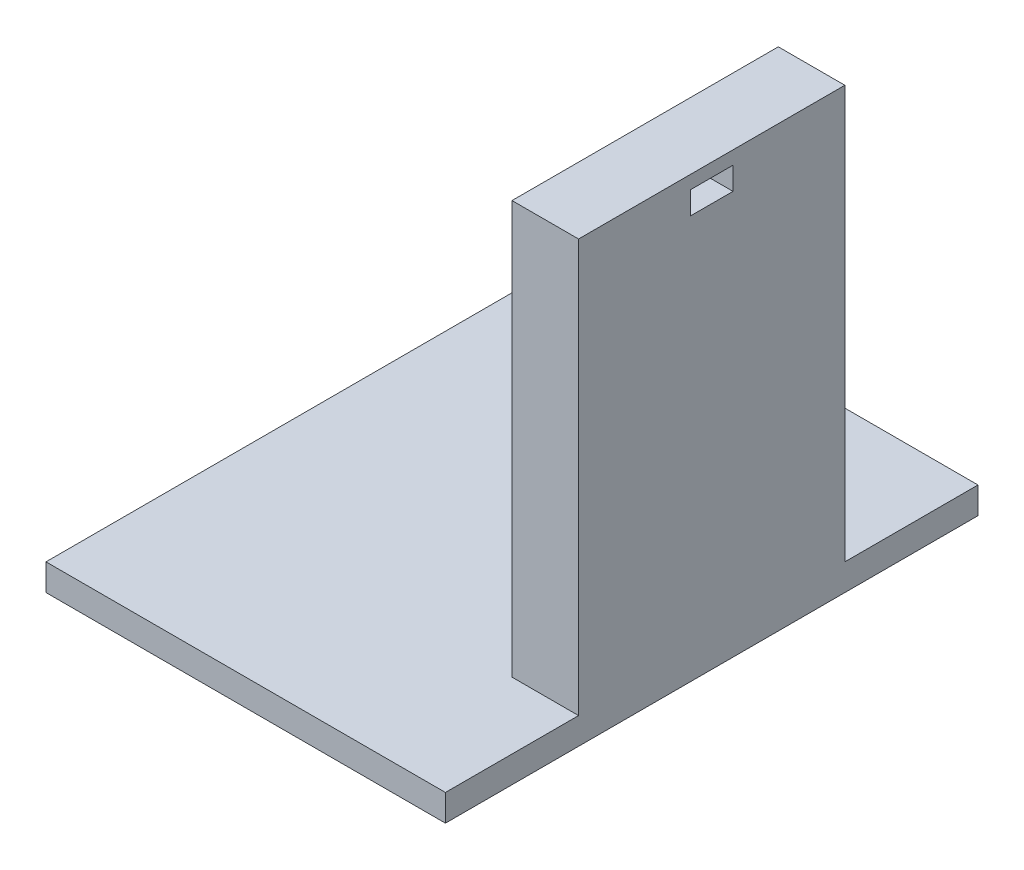
ISO-10303-21;
HEADER;
FILE_DESCRIPTION(('STEP AP214'),'2;1');
FILE_NAME('part.step','',(''),(''),'','','');
FILE_SCHEMA(('AUTOMOTIVE_DESIGN { 1 0 10303 214 1 1 1 1 }'));
ENDSEC;
DATA;
#1=APPLICATION_CONTEXT('core data for automotive mechanical design processes');
#2=APPLICATION_PROTOCOL_DEFINITION('international standard','automotive_design',2000,#1);
#3=PRODUCT_CONTEXT('',#1,'mechanical');
#4=PRODUCT('Part','Part','',(#3));
#5=PRODUCT_RELATED_PRODUCT_CATEGORY('part','',(#4));
#6=PRODUCT_DEFINITION_FORMATION('','',#4);
#7=PRODUCT_DEFINITION_CONTEXT('part definition',#1,'design');
#8=PRODUCT_DEFINITION('design','',#6,#7);
#9=PRODUCT_DEFINITION_SHAPE('','',#8);
#10=(LENGTH_UNIT() NAMED_UNIT(*) SI_UNIT(.MILLI.,.METRE.));
#11=(NAMED_UNIT(*) PLANE_ANGLE_UNIT() SI_UNIT($,.RADIAN.));
#12=(NAMED_UNIT(*) SI_UNIT($,.STERADIAN.) SOLID_ANGLE_UNIT());
#13=UNCERTAINTY_MEASURE_WITH_UNIT(LENGTH_MEASURE(1.E-05),#10,'distance_accuracy_value','');
#14=(GEOMETRIC_REPRESENTATION_CONTEXT(3) GLOBAL_UNCERTAINTY_ASSIGNED_CONTEXT((#13)) GLOBAL_UNIT_ASSIGNED_CONTEXT((#10,
#11,#12)) REPRESENTATION_CONTEXT('',''));
#15=CARTESIAN_POINT('',(0.,0.,0.));
#16=DIRECTION('',(0.,0.,1.));
#17=DIRECTION('',(1.,0.,0.));
#18=AXIS2_PLACEMENT_3D('',#15,#16,#17);
#19=CARTESIAN_POINT('',(-108.108131118763,5.,-106.7));
#20=DIRECTION('',(0.,-1.,0.));
#21=DIRECTION('',(0.,0.,-1.));
#22=AXIS2_PLACEMENT_3D('',#19,#20,#21);
#23=PLANE('',#22);
#24=CARTESIAN_POINT('',(-85.1540655593813,5.,-81.7));
#25=DIRECTION('',(0.,-1.,0.));
#26=DIRECTION('',(0.,0.,-1.));
#27=AXIS2_PLACEMENT_3D('',#24,#25,#26);
#28=CIRCLE('',#27,4.99999999999999);
#29=CARTESIAN_POINT('',(-85.1540655593813,5.,-86.7));
#30=VERTEX_POINT('',#29);
#31=EDGE_CURVE('E38',#30,#30,#28,.F.);
#32=ORIENTED_EDGE('',*,*,#31,.T.);
#33=EDGE_LOOP('',(#32));
#34=FACE_BOUND('',#33,.T.);
#35=DIRECTION('',(1.,0.,0.));
#36=VECTOR('',#35,1.);
#37=CARTESIAN_POINT('',(-108.108131118763,5.,-106.7));
#38=LINE('',#37,#36);
#39=CARTESIAN_POINT('',(-95.3081311187625,5.,-106.7));
#40=VERTEX_POINT('',#39);
#41=CARTESIAN_POINT('',(-75.,5.,-106.7));
#42=VERTEX_POINT('',#41);
#43=EDGE_CURVE('E196',#40,#42,#38,.T.);
#44=ORIENTED_EDGE('',*,*,#43,.T.);
#45=DIRECTION('',(0.,0.,1.));
#46=VECTOR('',#45,1.);
#47=CARTESIAN_POINT('',(-75.,5.,-56.7));
#48=LINE('',#47,#46);
#49=CARTESIAN_POINT('',(-75.,5.,-56.7));
#50=VERTEX_POINT('',#49);
#51=EDGE_CURVE('E195',#42,#50,#48,.T.);
#52=ORIENTED_EDGE('',*,*,#51,.T.);
#53=DIRECTION('',(1.,0.,0.));
#54=VECTOR('',#53,1.);
#55=CARTESIAN_POINT('',(-108.108131118763,5.,-56.7));
#56=LINE('',#55,#54);
#57=CARTESIAN_POINT('',(-95.3081311187625,5.,-56.7));
#58=VERTEX_POINT('',#57);
#59=EDGE_CURVE('E184',#58,#50,#56,.T.);
#60=ORIENTED_EDGE('',*,*,#59,.F.);
#61=DIRECTION('',(0.,0.,-1.));
#62=VECTOR('',#61,1.);
#63=CARTESIAN_POINT('',(-95.3081311187625,5.,-181.7));
#64=LINE('',#63,#62);
#65=EDGE_CURVE('E11',#58,#40,#64,.T.);
#66=ORIENTED_EDGE('',*,*,#65,.T.);
#67=EDGE_LOOP('',(#44,#52,#60,#66));
#68=FACE_BOUND('',#67,.T.);
#69=ADVANCED_FACE('F34',(#34,#68),#23,.T.);
#70=CARTESIAN_POINT('',(-108.108131118763,5.,-106.7));
#71=DIRECTION('',(0.,0.,1.));
#72=DIRECTION('',(1.,0.,0.));
#73=AXIS2_PLACEMENT_3D('',#70,#71,#72);
#74=PLANE('',#73);
#75=DIRECTION('',(1.,0.,0.));
#76=VECTOR('',#75,1.);
#77=CARTESIAN_POINT('',(0.,0.,-106.7));
#78=LINE('',#77,#76);
#79=CARTESIAN_POINT('',(-95.3081311187625,0.,-106.7));
#80=VERTEX_POINT('',#79);
#81=CARTESIAN_POINT('',(-75.,0.,-106.7));
#82=VERTEX_POINT('',#81);
#83=EDGE_CURVE('E43',#80,#82,#78,.T.);
#84=ORIENTED_EDGE('',*,*,#83,.T.);
#85=DIRECTION('',(0.,1.,0.));
#86=VECTOR('',#85,1.);
#87=CARTESIAN_POINT('',(-75.,5.00000000000002,-106.7));
#88=LINE('',#87,#86);
#89=EDGE_CURVE('E50',#82,#42,#88,.T.);
#90=ORIENTED_EDGE('',*,*,#89,.T.);
#91=ORIENTED_EDGE('',*,*,#43,.F.);
#92=DIRECTION('',(0.,-1.,0.));
#93=VECTOR('',#92,1.);
#94=CARTESIAN_POINT('',(-95.3081311187625,10.,-106.7));
#95=LINE('',#94,#93);
#96=EDGE_CURVE('E191',#40,#80,#95,.T.);
#97=ORIENTED_EDGE('',*,*,#96,.T.);
#98=EDGE_LOOP('',(#84,#90,#91,#97));
#99=FACE_BOUND('',#98,.T.);
#100=ADVANCED_FACE('F379',(#99),#74,.T.);
#101=CARTESIAN_POINT('',(-108.108131118763,5.,-56.7));
#102=DIRECTION('',(0.,0.,-1.));
#103=DIRECTION('',(0.,1.,0.));
#104=AXIS2_PLACEMENT_3D('',#101,#102,#103);
#105=PLANE('',#104);
#106=ORIENTED_EDGE('',*,*,#59,.T.);
#107=DIRECTION('',(0.,-1.,0.));
#108=VECTOR('',#107,1.);
#109=CARTESIAN_POINT('',(-75.,5.,-56.7));
#110=LINE('',#109,#108);
#111=CARTESIAN_POINT('',(-75.,0.,-56.7));
#112=VERTEX_POINT('',#111);
#113=EDGE_CURVE('E492',#50,#112,#110,.T.);
#114=ORIENTED_EDGE('',*,*,#113,.T.);
#115=DIRECTION('',(-1.,0.,0.));
#116=VECTOR('',#115,1.);
#117=CARTESIAN_POINT('',(0.,0.,-56.7));
#118=LINE('',#117,#116);
#119=CARTESIAN_POINT('',(-95.3081311187625,0.,-56.7));
#120=VERTEX_POINT('',#119);
#121=EDGE_CURVE('E187',#112,#120,#118,.T.);
#122=ORIENTED_EDGE('',*,*,#121,.T.);
#123=DIRECTION('',(0.,1.,0.));
#124=VECTOR('',#123,1.);
#125=CARTESIAN_POINT('',(-95.3081311187625,10.0000000000002,-56.7));
#126=LINE('',#125,#124);
#127=EDGE_CURVE('E181',#120,#58,#126,.T.);
#128=ORIENTED_EDGE('',*,*,#127,.T.);
#129=EDGE_LOOP('',(#106,#114,#122,#128));
#130=FACE_BOUND('',#129,.T.);
#131=ADVANCED_FACE('F183',(#130),#105,.T.);
#132=CARTESIAN_POINT('',(-95.3081311187625,10.,-181.7));
#133=DIRECTION('',(1.,0.,0.));
#134=DIRECTION('',(0.,0.,-1.));
#135=AXIS2_PLACEMENT_3D('',#132,#133,#134);
#136=PLANE('',#135);
#137=ORIENTED_EDGE('',*,*,#96,.F.);
#138=ORIENTED_EDGE('',*,*,#65,.F.);
#139=ORIENTED_EDGE('',*,*,#127,.F.);
#140=DIRECTION('',(0.,0.,1.));
#141=VECTOR('',#140,1.);
#142=CARTESIAN_POINT('',(-95.3081311187625,0.,-181.7));
#143=LINE('',#142,#141);
#144=CARTESIAN_POINT('',(-95.3081311187625,0.,18.3));
#145=VERTEX_POINT('',#144);
#146=EDGE_CURVE('E315',#120,#145,#143,.T.);
#147=ORIENTED_EDGE('',*,*,#146,.T.);
#148=DIRECTION('',(0.,-1.,0.));
#149=VECTOR('',#148,1.);
#150=CARTESIAN_POINT('',(-95.3081311187625,10.,18.3));
#151=LINE('',#150,#149);
#152=CARTESIAN_POINT('',(-95.3081311187625,10.,18.3));
#153=VERTEX_POINT('',#152);
#154=EDGE_CURVE('E341',#153,#145,#151,.T.);
#155=ORIENTED_EDGE('',*,*,#154,.F.);
#156=DIRECTION('',(0.,0.,1.));
#157=VECTOR('',#156,1.);
#158=CARTESIAN_POINT('',(-95.3081311187625,10.,-181.7));
#159=LINE('',#158,#157);
#160=CARTESIAN_POINT('',(-95.3081311187625,10.,-181.7));
#161=VERTEX_POINT('',#160);
#162=EDGE_CURVE('E316',#161,#153,#159,.T.);
#163=ORIENTED_EDGE('',*,*,#162,.F.);
#164=DIRECTION('',(0.,-1.,0.));
#165=VECTOR('',#164,1.);
#166=CARTESIAN_POINT('',(-95.3081311187625,10.,-181.7));
#167=LINE('',#166,#165);
#168=CARTESIAN_POINT('',(-95.3081311187625,0.,-181.7));
#169=VERTEX_POINT('',#168);
#170=EDGE_CURVE('E327',#161,#169,#167,.T.);
#171=ORIENTED_EDGE('',*,*,#170,.T.);
#172=EDGE_CURVE('E202',#169,#80,#143,.T.);
#173=ORIENTED_EDGE('',*,*,#172,.T.);
#174=EDGE_LOOP('',(#137,#138,#139,#147,#155,#163,#171,#173));
#175=FACE_BOUND('',#174,.T.);
#176=ADVANCED_FACE('F36',(#175),#136,.F.);
#177=CARTESIAN_POINT('',(0.,0.,0.));
#178=DIRECTION('',(0.,1.,0.));
#179=DIRECTION('',(0.,0.,1.));
#180=AXIS2_PLACEMENT_3D('',#177,#178,#179);
#181=PLANE('',#180);
#182=ORIENTED_EDGE('',*,*,#121,.F.);
#183=DIRECTION('',(0.,0.,-1.));
#184=VECTOR('',#183,1.);
#185=CARTESIAN_POINT('',(-75.,0.,-56.7000000000001));
#186=LINE('',#185,#184);
#187=EDGE_CURVE('E490',#112,#82,#186,.T.);
#188=ORIENTED_EDGE('',*,*,#187,.T.);
#189=ORIENTED_EDGE('',*,*,#83,.F.);
#190=ORIENTED_EDGE('',*,*,#172,.F.);
#191=DIRECTION('',(-1.,0.,0.));
#192=VECTOR('',#191,1.);
#193=CARTESIAN_POINT('',(-95.3081311187625,0.,-181.7));
#194=LINE('',#193,#192);
#195=CARTESIAN_POINT('',(54.6918688812375,0.,-181.7));
#196=VERTEX_POINT('',#195);
#197=EDGE_CURVE('E320',#196,#169,#194,.T.);
#198=ORIENTED_EDGE('',*,*,#197,.F.);
#199=DIRECTION('',(0.,0.,-1.));
#200=VECTOR('',#199,1.);
#201=CARTESIAN_POINT('',(54.6918688812375,0.,-181.7));
#202=LINE('',#201,#200);
#203=CARTESIAN_POINT('',(54.6918688812375,0.,18.3));
#204=VERTEX_POINT('',#203);
#205=EDGE_CURVE('E331',#204,#196,#202,.T.);
#206=ORIENTED_EDGE('',*,*,#205,.F.);
#207=DIRECTION('',(1.,0.,0.));
#208=VECTOR('',#207,1.);
#209=CARTESIAN_POINT('',(-95.3081311187625,0.,18.3));
#210=LINE('',#209,#208);
#211=EDGE_CURVE('E329',#145,#204,#210,.T.);
#212=ORIENTED_EDGE('',*,*,#211,.F.);
#213=ORIENTED_EDGE('',*,*,#146,.F.);
#214=EDGE_LOOP('',(#182,#188,#189,#190,#198,#206,#212,#213));
#215=FACE_BOUND('',#214,.T.);
#216=ADVANCED_FACE('F407',(#215),#181,.F.);
#217=CARTESIAN_POINT('',(0.,160.,0.));
#218=DIRECTION('',(0.,1.,0.));
#219=DIRECTION('',(0.,0.,1.));
#220=AXIS2_PLACEMENT_3D('',#217,#218,#219);
#221=PLANE('',#220);
#222=DIRECTION('',(0.,0.,1.));
#223=VECTOR('',#222,1.);
#224=CARTESIAN_POINT('',(41.8918688812375,160.,0.));
#225=LINE('',#224,#223);
#226=CARTESIAN_POINT('',(41.8918688812375,160.,-89.7));
#227=VERTEX_POINT('',#226);
#228=CARTESIAN_POINT('',(41.8918688812375,160.,-73.7));
#229=VERTEX_POINT('',#228);
#230=EDGE_CURVE('E344',#227,#229,#225,.T.);
#231=ORIENTED_EDGE('',*,*,#230,.F.);
#232=DIRECTION('',(-1.,0.,0.));
#233=VECTOR('',#232,1.);
#234=CARTESIAN_POINT('',(84.0918688812375,160.,-89.7));
#235=LINE('',#234,#233);
#236=CARTESIAN_POINT('',(54.6918688812375,160.,-89.7));
#237=VERTEX_POINT('',#236);
#238=EDGE_CURVE('E265',#237,#227,#235,.T.);
#239=ORIENTED_EDGE('',*,*,#238,.F.);
#240=DIRECTION('',(0.,0.,-1.));
#241=VECTOR('',#240,1.);
#242=CARTESIAN_POINT('',(54.6918688812375,160.,-131.7));
#243=LINE('',#242,#241);
#244=CARTESIAN_POINT('',(54.6918688812375,160.,-73.7));
#245=VERTEX_POINT('',#244);
#246=EDGE_CURVE('E215',#245,#237,#243,.T.);
#247=ORIENTED_EDGE('',*,*,#246,.F.);
#248=DIRECTION('',(-1.,0.,0.));
#249=VECTOR('',#248,1.);
#250=CARTESIAN_POINT('',(84.0918688812375,160.,-73.7));
#251=LINE('',#250,#249);
#252=EDGE_CURVE('E269',#245,#229,#251,.T.);
#253=ORIENTED_EDGE('',*,*,#252,.T.);
#254=EDGE_LOOP('',(#231,#239,#247,#253));
#255=FACE_BOUND('',#254,.T.);
#256=ADVANCED_FACE('F357',(#255),#221,.F.);
#257=CARTESIAN_POINT('',(0.,10.,0.));
#258=DIRECTION('',(0.,1.,0.));
#259=DIRECTION('',(0.,0.,1.));
#260=AXIS2_PLACEMENT_3D('',#257,#258,#259);
#261=PLANE('',#260);
#262=DIRECTION('',(0.,0.,-1.));
#263=VECTOR('',#262,1.);
#264=CARTESIAN_POINT('',(54.6918688812375,10.,-181.7));
#265=LINE('',#264,#263);
#266=CARTESIAN_POINT('',(54.6918688812375,10.,18.3));
#267=VERTEX_POINT('',#266);
#268=CARTESIAN_POINT('',(54.6918688812375,10.,-31.7));
#269=VERTEX_POINT('',#268);
#270=EDGE_CURVE('E323',#267,#269,#265,.T.);
#271=ORIENTED_EDGE('',*,*,#270,.T.);
#272=DIRECTION('',(-1.,0.,0.));
#273=VECTOR('',#272,1.);
#274=CARTESIAN_POINT('',(0.,10.,-31.7));
#275=LINE('',#274,#273);
#276=CARTESIAN_POINT('',(29.6918688812375,10.,-31.7));
#277=VERTEX_POINT('',#276);
#278=EDGE_CURVE('E313',#269,#277,#275,.T.);
#279=ORIENTED_EDGE('',*,*,#278,.T.);
#280=DIRECTION('',(0.,0.,1.));
#281=VECTOR('',#280,1.);
#282=CARTESIAN_POINT('',(29.6918688812375,10.,0.));
#283=LINE('',#282,#281);
#284=CARTESIAN_POINT('',(29.6918688812375,10.,-131.7));
#285=VERTEX_POINT('',#284);
#286=EDGE_CURVE('E307',#285,#277,#283,.T.);
#287=ORIENTED_EDGE('',*,*,#286,.F.);
#288=DIRECTION('',(-1.,0.,0.));
#289=VECTOR('',#288,1.);
#290=CARTESIAN_POINT('',(0.,10.,-131.7));
#291=LINE('',#290,#289);
#292=CARTESIAN_POINT('',(54.6918688812375,10.,-131.7));
#293=VERTEX_POINT('',#292);
#294=EDGE_CURVE('E310',#293,#285,#291,.T.);
#295=ORIENTED_EDGE('',*,*,#294,.F.);
#296=CARTESIAN_POINT('',(54.6918688812375,10.,-181.7));
#297=VERTEX_POINT('',#296);
#298=EDGE_CURVE('E322',#293,#297,#265,.T.);
#299=ORIENTED_EDGE('',*,*,#298,.T.);
#300=DIRECTION('',(-1.,0.,0.));
#301=VECTOR('',#300,1.);
#302=CARTESIAN_POINT('',(-95.3081311187625,10.,-181.7));
#303=LINE('',#302,#301);
#304=EDGE_CURVE('E325',#297,#161,#303,.T.);
#305=ORIENTED_EDGE('',*,*,#304,.T.);
#306=ORIENTED_EDGE('',*,*,#162,.T.);
#307=DIRECTION('',(1.,0.,0.));
#308=VECTOR('',#307,1.);
#309=CARTESIAN_POINT('',(-95.3081311187625,10.,18.3));
#310=LINE('',#309,#308);
#311=EDGE_CURVE('E319',#153,#267,#310,.T.);
#312=ORIENTED_EDGE('',*,*,#311,.T.);
#313=EDGE_LOOP('',(#271,#279,#287,#295,#299,#305,#306,#312));
#314=FACE_BOUND('',#313,.T.);
#315=ADVANCED_FACE('F406',(#314),#261,.T.);
#316=CARTESIAN_POINT('',(-95.3081311187625,10.,18.3));
#317=DIRECTION('',(0.,0.,-1.));
#318=DIRECTION('',(-1.,0.,0.));
#319=AXIS2_PLACEMENT_3D('',#316,#317,#318);
#320=PLANE('',#319);
#321=ORIENTED_EDGE('',*,*,#211,.T.);
#322=DIRECTION('',(0.,-1.,0.));
#323=VECTOR('',#322,1.);
#324=CARTESIAN_POINT('',(54.6918688812375,10.,18.3));
#325=LINE('',#324,#323);
#326=EDGE_CURVE('E338',#267,#204,#325,.T.);
#327=ORIENTED_EDGE('',*,*,#326,.F.);
#328=ORIENTED_EDGE('',*,*,#311,.F.);
#329=ORIENTED_EDGE('',*,*,#154,.T.);
#330=EDGE_LOOP('',(#321,#327,#328,#329));
#331=FACE_BOUND('',#330,.T.);
#332=ADVANCED_FACE('F458',(#331),#320,.F.);
#333=CARTESIAN_POINT('',(54.6918688812375,10.,-181.7));
#334=DIRECTION('',(-1.,0.,0.));
#335=DIRECTION('',(0.,0.,1.));
#336=AXIS2_PLACEMENT_3D('',#333,#334,#335);
#337=PLANE('',#336);
#338=DIRECTION('',(0.,-1.,0.));
#339=VECTOR('',#338,1.);
#340=CARTESIAN_POINT('',(54.6918688812375,160.,-131.7));
#341=LINE('',#340,#339);
#342=CARTESIAN_POINT('',(54.6918688812375,165.,-131.7));
#343=VERTEX_POINT('',#342);
#344=EDGE_CURVE('E301',#343,#293,#341,.T.);
#345=ORIENTED_EDGE('',*,*,#344,.F.);
#346=DIRECTION('',(0.,0.,-1.));
#347=VECTOR('',#346,1.);
#348=CARTESIAN_POINT('',(54.6918688812375,165.,-131.7));
#349=LINE('',#348,#347);
#350=CARTESIAN_POINT('',(54.6918688812375,165.,-31.7));
#351=VERTEX_POINT('',#350);
#352=EDGE_CURVE('E224',#351,#343,#349,.T.);
#353=ORIENTED_EDGE('',*,*,#352,.F.);
#354=DIRECTION('',(0.,-1.,0.));
#355=VECTOR('',#354,1.);
#356=CARTESIAN_POINT('',(54.6918688812375,160.,-31.7));
#357=LINE('',#356,#355);
#358=EDGE_CURVE('E304',#351,#269,#357,.T.);
#359=ORIENTED_EDGE('',*,*,#358,.T.);
#360=ORIENTED_EDGE('',*,*,#270,.F.);
#361=ORIENTED_EDGE('',*,*,#326,.T.);
#362=ORIENTED_EDGE('',*,*,#205,.T.);
#363=DIRECTION('',(0.,-1.,0.));
#364=VECTOR('',#363,1.);
#365=CARTESIAN_POINT('',(54.6918688812375,10.,-181.7));
#366=LINE('',#365,#364);
#367=EDGE_CURVE('E335',#297,#196,#366,.T.);
#368=ORIENTED_EDGE('',*,*,#367,.F.);
#369=ORIENTED_EDGE('',*,*,#298,.F.);
#370=EDGE_LOOP('',(#345,#353,#359,#360,#361,#362,#368,#369));
#371=FACE_BOUND('',#370,.T.);
#372=ORIENTED_EDGE('',*,*,#246,.T.);
#373=DIRECTION('',(0.,-1.,0.));
#374=VECTOR('',#373,1.);
#375=CARTESIAN_POINT('',(54.6918688812375,10.,-89.7));
#376=LINE('',#375,#374);
#377=CARTESIAN_POINT('',(54.6918688812375,151.485851019559,-89.7));
#378=VERTEX_POINT('',#377);
#379=EDGE_CURVE('E281',#237,#378,#376,.T.);
#380=ORIENTED_EDGE('',*,*,#379,.T.);
#381=DIRECTION('',(0.,0.,1.));
#382=VECTOR('',#381,1.);
#383=CARTESIAN_POINT('',(54.6918688812375,151.485851019559,-181.7));
#384=LINE('',#383,#382);
#385=CARTESIAN_POINT('',(54.6918688812375,151.485851019559,-73.7));
#386=VERTEX_POINT('',#385);
#387=EDGE_CURVE('E268',#378,#386,#384,.T.);
#388=ORIENTED_EDGE('',*,*,#387,.T.);
#389=DIRECTION('',(0.,1.,0.));
#390=VECTOR('',#389,1.);
#391=CARTESIAN_POINT('',(54.6918688812375,10.,-73.7));
#392=LINE('',#391,#390);
#393=EDGE_CURVE('E278',#386,#245,#392,.T.);
#394=ORIENTED_EDGE('',*,*,#393,.T.);
#395=EDGE_LOOP('',(#372,#380,#388,#394));
#396=FACE_BOUND('',#395,.T.);
#397=ADVANCED_FACE('F360',(#371,#396),#337,.F.);
#398=CARTESIAN_POINT('',(-95.3081311187625,10.,-181.7));
#399=DIRECTION('',(0.,0.,1.));
#400=DIRECTION('',(1.,0.,0.));
#401=AXIS2_PLACEMENT_3D('',#398,#399,#400);
#402=PLANE('',#401);
#403=ORIENTED_EDGE('',*,*,#197,.T.);
#404=ORIENTED_EDGE('',*,*,#170,.F.);
#405=ORIENTED_EDGE('',*,*,#304,.F.);
#406=ORIENTED_EDGE('',*,*,#367,.T.);
#407=EDGE_LOOP('',(#403,#404,#405,#406));
#408=FACE_BOUND('',#407,.T.);
#409=ADVANCED_FACE('F454',(#408),#402,.F.);
#410=CARTESIAN_POINT('',(0.,160.,-31.7));
#411=DIRECTION('',(0.,0.,-1.));
#412=DIRECTION('',(-1.,0.,0.));
#413=AXIS2_PLACEMENT_3D('',#410,#411,#412);
#414=PLANE('',#413);
#415=ORIENTED_EDGE('',*,*,#278,.F.);
#416=ORIENTED_EDGE('',*,*,#358,.F.);
#417=DIRECTION('',(1.,0.,0.));
#418=VECTOR('',#417,1.);
#419=CARTESIAN_POINT('',(29.6918688812375,165.,-31.7));
#420=LINE('',#419,#418);
#421=CARTESIAN_POINT('',(29.6918688812375,165.,-31.7));
#422=VERTEX_POINT('',#421);
#423=EDGE_CURVE('E221',#422,#351,#420,.T.);
#424=ORIENTED_EDGE('',*,*,#423,.F.);
#425=DIRECTION('',(0.,-1.,0.));
#426=VECTOR('',#425,1.);
#427=CARTESIAN_POINT('',(29.6918688812375,160.,-31.7));
#428=LINE('',#427,#426);
#429=EDGE_CURVE('E293',#422,#277,#428,.T.);
#430=ORIENTED_EDGE('',*,*,#429,.T.);
#431=EDGE_LOOP('',(#415,#416,#424,#430));
#432=FACE_BOUND('',#431,.T.);
#433=ADVANCED_FACE('F450',(#432),#414,.F.);
#434=CARTESIAN_POINT('',(0.,160.,-131.7));
#435=DIRECTION('',(0.,0.,-1.));
#436=DIRECTION('',(-1.,0.,0.));
#437=AXIS2_PLACEMENT_3D('',#434,#435,#436);
#438=PLANE('',#437);
#439=ORIENTED_EDGE('',*,*,#344,.T.);
#440=ORIENTED_EDGE('',*,*,#294,.T.);
#441=DIRECTION('',(0.,-1.,0.));
#442=VECTOR('',#441,1.);
#443=CARTESIAN_POINT('',(29.6918688812375,160.,-131.7));
#444=LINE('',#443,#442);
#445=CARTESIAN_POINT('',(29.6918688812375,165.,-131.7));
#446=VERTEX_POINT('',#445);
#447=EDGE_CURVE('E298',#446,#285,#444,.T.);
#448=ORIENTED_EDGE('',*,*,#447,.F.);
#449=DIRECTION('',(-1.,0.,0.));
#450=VECTOR('',#449,1.);
#451=CARTESIAN_POINT('',(29.6918688812375,165.,-131.7));
#452=LINE('',#451,#450);
#453=EDGE_CURVE('E227',#343,#446,#452,.T.);
#454=ORIENTED_EDGE('',*,*,#453,.F.);
#455=EDGE_LOOP('',(#439,#440,#448,#454));
#456=FACE_BOUND('',#455,.T.);
#457=ADVANCED_FACE('F445',(#456),#438,.T.);
#458=CARTESIAN_POINT('',(29.6918688812375,160.,0.));
#459=DIRECTION('',(-1.,0.,0.));
#460=DIRECTION('',(0.,0.,1.));
#461=AXIS2_PLACEMENT_3D('',#458,#459,#460);
#462=PLANE('',#461);
#463=DIRECTION('',(0.,-1.,0.));
#464=VECTOR('',#463,1.);
#465=CARTESIAN_POINT('',(29.6918688812375,160.,-94.4));
#466=LINE('',#465,#464);
#467=CARTESIAN_POINT('',(29.6918688812375,160.5,-94.4));
#468=VERTEX_POINT('',#467);
#469=CARTESIAN_POINT('',(29.6918688812375,139.97,-94.4));
#470=VERTEX_POINT('',#469);
#471=EDGE_CURVE('E240',#468,#470,#466,.T.);
#472=ORIENTED_EDGE('',*,*,#471,.F.);
#473=DIRECTION('',(0.,0.,-1.));
#474=VECTOR('',#473,1.);
#475=CARTESIAN_POINT('',(29.6918688812375,160.5,-69.));
#476=LINE('',#475,#474);
#477=CARTESIAN_POINT('',(29.6918688812375,160.5,-69.));
#478=VERTEX_POINT('',#477);
#479=EDGE_CURVE('E203',#478,#468,#476,.T.);
#480=ORIENTED_EDGE('',*,*,#479,.F.);
#481=DIRECTION('',(0.,1.,0.));
#482=VECTOR('',#481,1.);
#483=CARTESIAN_POINT('',(29.6918688812375,139.97,-69.));
#484=LINE('',#483,#482);
#485=CARTESIAN_POINT('',(29.6918688812375,139.97,-69.));
#486=VERTEX_POINT('',#485);
#487=EDGE_CURVE('E251',#486,#478,#484,.T.);
#488=ORIENTED_EDGE('',*,*,#487,.F.);
#489=DIRECTION('',(0.,-0.00340405851310588,0.999994206176036));
#490=VECTOR('',#489,1.);
#491=CARTESIAN_POINT('',(29.6918688812375,139.97,-69.));
#492=LINE('',#491,#490);
#493=CARTESIAN_POINT('',(29.6918688812375,139.971702039118,-69.5));
#494=VERTEX_POINT('',#493);
#495=EDGE_CURVE('E230',#494,#486,#492,.T.);
#496=ORIENTED_EDGE('',*,*,#495,.F.);
#497=DIRECTION('',(0.,0.,1.));
#498=VECTOR('',#497,1.);
#499=CARTESIAN_POINT('',(29.6918688812375,139.971702039118,-93.9));
#500=LINE('',#499,#498);
#501=CARTESIAN_POINT('',(29.6918688812375,139.971702039118,-93.9));
#502=VERTEX_POINT('',#501);
#503=EDGE_CURVE('E284',#502,#494,#500,.T.);
#504=ORIENTED_EDGE('',*,*,#503,.F.);
#505=DIRECTION('',(0.,0.00340405851305028,0.999994206176036));
#506=VECTOR('',#505,1.);
#507=CARTESIAN_POINT('',(29.6918688812375,139.971702039118,-93.9));
#508=LINE('',#507,#506);
#509=EDGE_CURVE('E237',#470,#502,#508,.T.);
#510=ORIENTED_EDGE('',*,*,#509,.F.);
#511=EDGE_LOOP('',(#472,#480,#488,#496,#504,#510));
#512=FACE_BOUND('',#511,.T.);
#513=DIRECTION('',(0.,0.,1.));
#514=VECTOR('',#513,1.);
#515=CARTESIAN_POINT('',(29.6918688812375,165.,-131.7));
#516=LINE('',#515,#514);
#517=EDGE_CURVE('E218',#446,#422,#516,.T.);
#518=ORIENTED_EDGE('',*,*,#517,.F.);
#519=ORIENTED_EDGE('',*,*,#447,.T.);
#520=ORIENTED_EDGE('',*,*,#286,.T.);
#521=ORIENTED_EDGE('',*,*,#429,.F.);
#522=EDGE_LOOP('',(#518,#519,#520,#521));
#523=FACE_BOUND('',#522,.T.);
#524=ADVANCED_FACE('F425',(#512,#523),#462,.T.);
#525=CARTESIAN_POINT('',(41.8918688812375,139.971702039118,-93.9));
#526=DIRECTION('',(0.,-1.,0.));
#527=DIRECTION('',(0.,0.,-1.));
#528=AXIS2_PLACEMENT_3D('',#525,#526,#527);
#529=PLANE('',#528);
#530=ORIENTED_EDGE('',*,*,#503,.T.);
#531=DIRECTION('',(-1.,0.,0.));
#532=VECTOR('',#531,1.);
#533=CARTESIAN_POINT('',(41.8918688812375,139.971702039118,-69.5));
#534=LINE('',#533,#532);
#535=CARTESIAN_POINT('',(41.8918688812375,139.971702039118,-69.5));
#536=VERTEX_POINT('',#535);
#537=EDGE_CURVE('E291',#536,#494,#534,.T.);
#538=ORIENTED_EDGE('',*,*,#537,.F.);
#539=DIRECTION('',(0.,0.,1.));
#540=VECTOR('',#539,1.);
#541=CARTESIAN_POINT('',(41.8918688812375,139.971702039118,-93.9));
#542=LINE('',#541,#540);
#543=CARTESIAN_POINT('',(41.8918688812375,139.971702039118,-93.9));
#544=VERTEX_POINT('',#543);
#545=EDGE_CURVE('E285',#544,#536,#542,.T.);
#546=ORIENTED_EDGE('',*,*,#545,.F.);
#547=DIRECTION('',(-1.,0.,0.));
#548=VECTOR('',#547,1.);
#549=CARTESIAN_POINT('',(41.8918688812375,139.971702039118,-93.9));
#550=LINE('',#549,#548);
#551=EDGE_CURVE('E288',#544,#502,#550,.T.);
#552=ORIENTED_EDGE('',*,*,#551,.T.);
#553=EDGE_LOOP('',(#530,#538,#546,#552));
#554=FACE_BOUND('',#553,.T.);
#555=ADVANCED_FACE('F434',(#554),#529,.F.);
#556=CARTESIAN_POINT('',(41.8918688812375,0.,0.));
#557=DIRECTION('',(1.,0.,0.));
#558=DIRECTION('',(0.,0.,-1.));
#559=AXIS2_PLACEMENT_3D('',#556,#557,#558);
#560=PLANE('',#559);
#561=DIRECTION('',(0.,0.,-1.));
#562=VECTOR('',#561,1.);
#563=CARTESIAN_POINT('',(41.8918688812375,160.5,-69.));
#564=LINE('',#563,#562);
#565=CARTESIAN_POINT('',(41.8918688812375,160.5,-69.));
#566=VERTEX_POINT('',#565);
#567=CARTESIAN_POINT('',(41.8918688812375,160.5,-94.4));
#568=VERTEX_POINT('',#567);
#569=EDGE_CURVE('E206',#566,#568,#564,.T.);
#570=ORIENTED_EDGE('',*,*,#569,.T.);
#571=DIRECTION('',(0.,-1.,0.));
#572=VECTOR('',#571,1.);
#573=CARTESIAN_POINT('',(41.8918688812375,160.,-94.4));
#574=LINE('',#573,#572);
#575=CARTESIAN_POINT('',(41.8918688812375,139.97,-94.4));
#576=VERTEX_POINT('',#575);
#577=EDGE_CURVE('E233',#568,#576,#574,.T.);
#578=ORIENTED_EDGE('',*,*,#577,.T.);
#579=DIRECTION('',(0.,0.00340405851305028,0.999994206176036));
#580=VECTOR('',#579,1.);
#581=CARTESIAN_POINT('',(41.8918688812375,139.971702039118,-93.9));
#582=LINE('',#581,#580);
#583=EDGE_CURVE('E236',#576,#544,#582,.T.);
#584=ORIENTED_EDGE('',*,*,#583,.T.);
#585=ORIENTED_EDGE('',*,*,#545,.T.);
#586=DIRECTION('',(0.,-0.00340405851310588,0.999994206176036));
#587=VECTOR('',#586,1.);
#588=CARTESIAN_POINT('',(41.8918688812375,139.97,-69.));
#589=LINE('',#588,#587);
#590=CARTESIAN_POINT('',(41.8918688812375,139.97,-69.));
#591=VERTEX_POINT('',#590);
#592=EDGE_CURVE('E247',#536,#591,#589,.T.);
#593=ORIENTED_EDGE('',*,*,#592,.T.);
#594=DIRECTION('',(0.,1.,0.));
#595=VECTOR('',#594,1.);
#596=CARTESIAN_POINT('',(41.8918688812375,139.97,-69.));
#597=LINE('',#596,#595);
#598=EDGE_CURVE('E250',#591,#566,#597,.T.);
#599=ORIENTED_EDGE('',*,*,#598,.T.);
#600=EDGE_LOOP('',(#570,#578,#584,#585,#593,#599));
#601=FACE_BOUND('',#600,.T.);
#602=DIRECTION('',(0.,0.,1.));
#603=VECTOR('',#602,1.);
#604=CARTESIAN_POINT('',(41.8918688812375,151.485851019559,-89.7));
#605=LINE('',#604,#603);
#606=CARTESIAN_POINT('',(41.8918688812375,151.485851019559,-89.7));
#607=VERTEX_POINT('',#606);
#608=CARTESIAN_POINT('',(41.8918688812375,151.485851019559,-73.7));
#609=VERTEX_POINT('',#608);
#610=EDGE_CURVE('E258',#607,#609,#605,.T.);
#611=ORIENTED_EDGE('',*,*,#610,.F.);
#612=DIRECTION('',(0.,-1.,0.));
#613=VECTOR('',#612,1.);
#614=CARTESIAN_POINT('',(41.8918688812375,160.,-89.7));
#615=LINE('',#614,#613);
#616=EDGE_CURVE('E246',#227,#607,#615,.T.);
#617=ORIENTED_EDGE('',*,*,#616,.F.);
#618=ORIENTED_EDGE('',*,*,#230,.T.);
#619=DIRECTION('',(0.,1.,0.));
#620=VECTOR('',#619,1.);
#621=CARTESIAN_POINT('',(41.8918688812375,160.,-73.7));
#622=LINE('',#621,#620);
#623=EDGE_CURVE('E261',#609,#229,#622,.T.);
#624=ORIENTED_EDGE('',*,*,#623,.F.);
#625=EDGE_LOOP('',(#611,#617,#618,#624));
#626=FACE_BOUND('',#625,.T.);
#627=ADVANCED_FACE('F351',(#601,#626),#560,.F.);
#628=CARTESIAN_POINT('',(84.0918688812375,160.,-89.7));
#629=DIRECTION('',(0.,0.,-1.));
#630=DIRECTION('',(-1.,0.,0.));
#631=AXIS2_PLACEMENT_3D('',#628,#629,#630);
#632=PLANE('',#631);
#633=ORIENTED_EDGE('',*,*,#238,.T.);
#634=ORIENTED_EDGE('',*,*,#616,.T.);
#635=DIRECTION('',(-1.,0.,0.));
#636=VECTOR('',#635,1.);
#637=CARTESIAN_POINT('',(84.0918688812375,151.485851019559,-89.7));
#638=LINE('',#637,#636);
#639=EDGE_CURVE('E264',#378,#607,#638,.T.);
#640=ORIENTED_EDGE('',*,*,#639,.F.);
#641=ORIENTED_EDGE('',*,*,#379,.F.);
#642=EDGE_LOOP('',(#633,#634,#640,#641));
#643=FACE_BOUND('',#642,.T.);
#644=ADVANCED_FACE('F363',(#643),#632,.F.);
#645=CARTESIAN_POINT('',(84.0918688812375,160.,-73.7));
#646=DIRECTION('',(0.,0.,1.));
#647=DIRECTION('',(1.,0.,0.));
#648=AXIS2_PLACEMENT_3D('',#645,#646,#647);
#649=PLANE('',#648);
#650=DIRECTION('',(-1.,0.,0.));
#651=VECTOR('',#650,1.);
#652=CARTESIAN_POINT('',(84.0918688812375,151.485851019559,-73.7));
#653=LINE('',#652,#651);
#654=EDGE_CURVE('E272',#386,#609,#653,.T.);
#655=ORIENTED_EDGE('',*,*,#654,.T.);
#656=ORIENTED_EDGE('',*,*,#623,.T.);
#657=ORIENTED_EDGE('',*,*,#252,.F.);
#658=ORIENTED_EDGE('',*,*,#393,.F.);
#659=EDGE_LOOP('',(#655,#656,#657,#658));
#660=FACE_BOUND('',#659,.T.);
#661=ADVANCED_FACE('F354',(#660),#649,.F.);
#662=CARTESIAN_POINT('',(84.0918688812375,151.485851019559,-89.7));
#663=DIRECTION('',(0.,-1.,0.));
#664=DIRECTION('',(0.,0.,-1.));
#665=AXIS2_PLACEMENT_3D('',#662,#663,#664);
#666=PLANE('',#665);
#667=ORIENTED_EDGE('',*,*,#639,.T.);
#668=ORIENTED_EDGE('',*,*,#610,.T.);
#669=ORIENTED_EDGE('',*,*,#654,.F.);
#670=ORIENTED_EDGE('',*,*,#387,.F.);
#671=EDGE_LOOP('',(#667,#668,#669,#670));
#672=FACE_BOUND('',#671,.T.);
#673=ADVANCED_FACE('F365',(#672),#666,.F.);
#674=CARTESIAN_POINT('',(41.8918688812375,139.97,-69.));
#675=DIRECTION('',(0.,0.,1.));
#676=DIRECTION('',(1.,0.,0.));
#677=AXIS2_PLACEMENT_3D('',#674,#675,#676);
#678=PLANE('',#677);
#679=ORIENTED_EDGE('',*,*,#487,.T.);
#680=DIRECTION('',(-1.,0.,0.));
#681=VECTOR('',#680,1.);
#682=CARTESIAN_POINT('',(41.8918688812375,160.5,-69.));
#683=LINE('',#682,#681);
#684=EDGE_CURVE('E210',#566,#478,#683,.T.);
#685=ORIENTED_EDGE('',*,*,#684,.F.);
#686=ORIENTED_EDGE('',*,*,#598,.F.);
#687=DIRECTION('',(-1.,0.,0.));
#688=VECTOR('',#687,1.);
#689=CARTESIAN_POINT('',(41.8918688812375,139.97,-69.));
#690=LINE('',#689,#688);
#691=EDGE_CURVE('E243',#591,#486,#690,.T.);
#692=ORIENTED_EDGE('',*,*,#691,.T.);
#693=EDGE_LOOP('',(#679,#685,#686,#692));
#694=FACE_BOUND('',#693,.T.);
#695=ADVANCED_FACE('F367',(#694),#678,.F.);
#696=CARTESIAN_POINT('',(41.8918688812375,139.97,-69.));
#697=DIRECTION('',(0.,-0.999994206176035,-0.00340405851310588));
#698=DIRECTION('',(0.,0.00340405851310589,-0.999994206176036));
#699=AXIS2_PLACEMENT_3D('',#696,#697,#698);
#700=PLANE('',#699);
#701=ORIENTED_EDGE('',*,*,#495,.T.);
#702=ORIENTED_EDGE('',*,*,#691,.F.);
#703=ORIENTED_EDGE('',*,*,#592,.F.);
#704=ORIENTED_EDGE('',*,*,#537,.T.);
#705=EDGE_LOOP('',(#701,#702,#703,#704));
#706=FACE_BOUND('',#705,.T.);
#707=ADVANCED_FACE('F373',(#706),#700,.F.);
#708=CARTESIAN_POINT('',(41.8918688812375,139.971702039118,-93.9));
#709=DIRECTION('',(0.,-0.999994206176036,0.00340405851305028));
#710=DIRECTION('',(0.,-0.00340405851305028,-0.999994206176036));
#711=AXIS2_PLACEMENT_3D('',#708,#709,#710);
#712=PLANE('',#711);
#713=ORIENTED_EDGE('',*,*,#509,.T.);
#714=ORIENTED_EDGE('',*,*,#551,.F.);
#715=ORIENTED_EDGE('',*,*,#583,.F.);
#716=DIRECTION('',(-1.,0.,0.));
#717=VECTOR('',#716,1.);
#718=CARTESIAN_POINT('',(41.8918688812375,139.97,-94.4));
#719=LINE('',#718,#717);
#720=EDGE_CURVE('E239',#576,#470,#719,.T.);
#721=ORIENTED_EDGE('',*,*,#720,.T.);
#722=EDGE_LOOP('',(#713,#714,#715,#721));
#723=FACE_BOUND('',#722,.T.);
#724=ADVANCED_FACE('F408',(#723),#712,.F.);
#725=CARTESIAN_POINT('',(41.8918688812375,160.,-94.4));
#726=DIRECTION('',(0.,0.,-1.));
#727=DIRECTION('',(-1.,0.,0.));
#728=AXIS2_PLACEMENT_3D('',#725,#726,#727);
#729=PLANE('',#728);
#730=ORIENTED_EDGE('',*,*,#471,.T.);
#731=ORIENTED_EDGE('',*,*,#720,.F.);
#732=ORIENTED_EDGE('',*,*,#577,.F.);
#733=DIRECTION('',(-1.,0.,0.));
#734=VECTOR('',#733,1.);
#735=CARTESIAN_POINT('',(41.8918688812375,160.5,-94.4));
#736=LINE('',#735,#734);
#737=EDGE_CURVE('E212',#568,#468,#736,.T.);
#738=ORIENTED_EDGE('',*,*,#737,.T.);
#739=EDGE_LOOP('',(#730,#731,#732,#738));
#740=FACE_BOUND('',#739,.T.);
#741=ADVANCED_FACE('F402',(#740),#729,.F.);
#742=CARTESIAN_POINT('',(0.,165.,0.));
#743=DIRECTION('',(0.,1.,0.));
#744=DIRECTION('',(0.,0.,1.));
#745=AXIS2_PLACEMENT_3D('',#742,#743,#744);
#746=PLANE('',#745);
#747=ORIENTED_EDGE('',*,*,#517,.T.);
#748=ORIENTED_EDGE('',*,*,#423,.T.);
#749=ORIENTED_EDGE('',*,*,#352,.T.);
#750=ORIENTED_EDGE('',*,*,#453,.T.);
#751=EDGE_LOOP('',(#747,#748,#749,#750));
#752=FACE_BOUND('',#751,.T.);
#753=ADVANCED_FACE('F398',(#752),#746,.T.);
#754=CARTESIAN_POINT('',(41.8918688812375,160.5,-69.));
#755=DIRECTION('',(0.,1.,0.));
#756=DIRECTION('',(0.,0.,1.));
#757=AXIS2_PLACEMENT_3D('',#754,#755,#756);
#758=PLANE('',#757);
#759=ORIENTED_EDGE('',*,*,#479,.T.);
#760=ORIENTED_EDGE('',*,*,#737,.F.);
#761=ORIENTED_EDGE('',*,*,#569,.F.);
#762=ORIENTED_EDGE('',*,*,#684,.T.);
#763=EDGE_LOOP('',(#759,#760,#761,#762));
#764=FACE_BOUND('',#763,.T.);
#765=ADVANCED_FACE('F395',(#764),#758,.F.);
#766=CARTESIAN_POINT('',(-75.,0.,0.));
#767=DIRECTION('',(1.,0.,0.));
#768=DIRECTION('',(0.,0.,-1.));
#769=AXIS2_PLACEMENT_3D('',#766,#767,#768);
#770=PLANE('',#769);
#771=ORIENTED_EDGE('',*,*,#113,.F.);
#772=ORIENTED_EDGE('',*,*,#51,.F.);
#773=ORIENTED_EDGE('',*,*,#89,.F.);
#774=ORIENTED_EDGE('',*,*,#187,.F.);
#775=EDGE_LOOP('',(#771,#772,#773,#774));
#776=FACE_BOUND('',#775,.T.);
#777=ADVANCED_FACE('F391',(#776),#770,.F.);
#778=CARTESIAN_POINT('',(-85.1540655593813,6.,-81.7));
#779=DIRECTION('',(0.,-1.,0.));
#780=DIRECTION('',(0.,0.,-1.));
#781=AXIS2_PLACEMENT_3D('',#778,#779,#780);
#782=CYLINDRICAL_SURFACE('',#781,4.99999999999999);
#783=ORIENTED_EDGE('',*,*,#31,.F.);
#784=EDGE_LOOP('',(#783));
#785=FACE_BOUND('',#784,.T.);
#786=CARTESIAN_POINT('',(-85.1540655593813,0.,-81.7));
#787=DIRECTION('',(0.,1.,0.));
#788=DIRECTION('',(0.,0.,1.));
#789=AXIS2_PLACEMENT_3D('',#786,#787,#788);
#790=CIRCLE('',#789,4.99999999999999);
#791=CARTESIAN_POINT('',(-85.1540655593813,0.,-76.7));
#792=VERTEX_POINT('',#791);
#793=EDGE_CURVE('E499',#792,#792,#790,.T.);
#794=ORIENTED_EDGE('',*,*,#793,.T.);
#795=EDGE_LOOP('',(#794));
#796=FACE_BOUND('',#795,.T.);
#797=ADVANCED_FACE('F505',(#785,#796),#782,.T.);
#798=CARTESIAN_POINT('',(-85.1540655593813,0.,-81.7));
#799=DIRECTION('',(0.,1.,0.));
#800=DIRECTION('',(0.,0.,1.));
#801=AXIS2_PLACEMENT_3D('',#798,#799,#800);
#802=PLANE('',#801);
#803=ORIENTED_EDGE('',*,*,#793,.F.);
#804=EDGE_LOOP('',(#803));
#805=FACE_BOUND('',#804,.T.);
#806=ADVANCED_FACE('F507',(#805),#802,.F.);
#807=CLOSED_SHELL('',(#69,#100,#131,#176,#216,#256,#315,#332,#397,#409,#433,#457,#524,#555,#627,
#644,#661,#673,#695,#707,#724,#741,#753,#765,#777,#797,#806));
#808=MANIFOLD_SOLID_BREP('B2',#807);
#809=ADVANCED_BREP_SHAPE_REPRESENTATION('',(#18,#808),#14);
#810=SHAPE_DEFINITION_REPRESENTATION(#9,#809);
ENDSEC;
END-ISO-10303-21;
